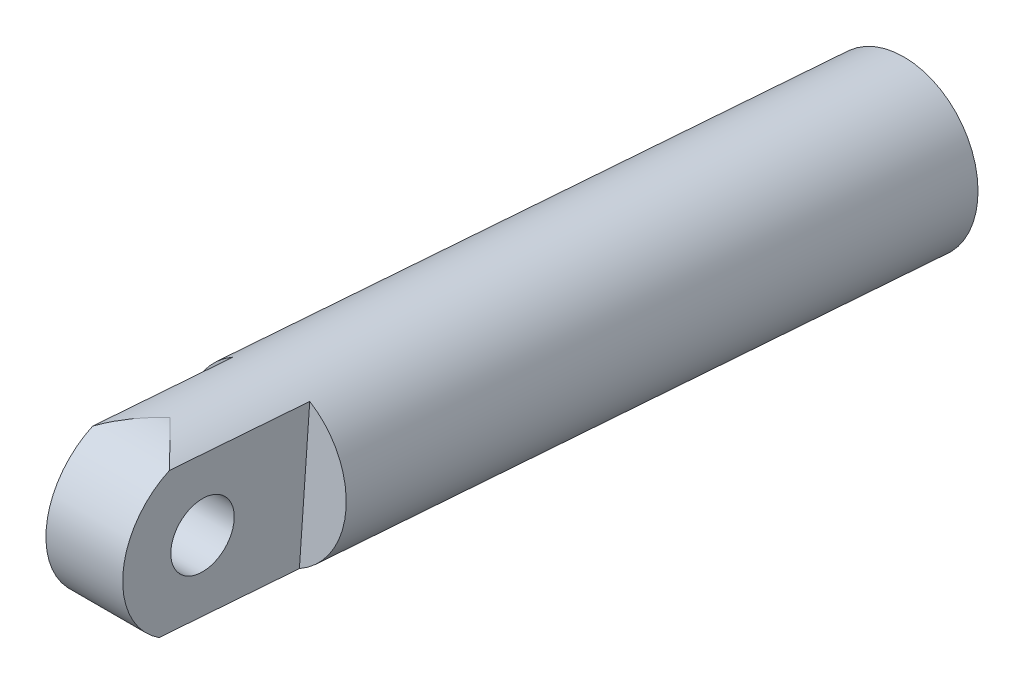
ISO-10303-21;
HEADER;
FILE_DESCRIPTION(('STEP AP214'),'2;1');
FILE_NAME('part.step','',(''),(''),'','','');
FILE_SCHEMA(('AUTOMOTIVE_DESIGN { 1 0 10303 214 1 1 1 1 }'));
ENDSEC;
DATA;
#1=APPLICATION_CONTEXT('core data for automotive mechanical design processes');
#2=APPLICATION_PROTOCOL_DEFINITION('international standard','automotive_design',2000,#1);
#3=PRODUCT_CONTEXT('',#1,'mechanical');
#4=PRODUCT('Part','Part','',(#3));
#5=PRODUCT_RELATED_PRODUCT_CATEGORY('part','',(#4));
#6=PRODUCT_DEFINITION_FORMATION('','',#4);
#7=PRODUCT_DEFINITION_CONTEXT('part definition',#1,'design');
#8=PRODUCT_DEFINITION('design','',#6,#7);
#9=PRODUCT_DEFINITION_SHAPE('','',#8);
#10=(LENGTH_UNIT() NAMED_UNIT(*) SI_UNIT(.MILLI.,.METRE.));
#11=(NAMED_UNIT(*) PLANE_ANGLE_UNIT() SI_UNIT($,.RADIAN.));
#12=(NAMED_UNIT(*) SI_UNIT($,.STERADIAN.) SOLID_ANGLE_UNIT());
#13=UNCERTAINTY_MEASURE_WITH_UNIT(LENGTH_MEASURE(1.E-05),#10,'distance_accuracy_value','');
#14=(GEOMETRIC_REPRESENTATION_CONTEXT(3) GLOBAL_UNCERTAINTY_ASSIGNED_CONTEXT((#13)) GLOBAL_UNIT_ASSIGNED_CONTEXT((#10,
#11,#12)) REPRESENTATION_CONTEXT('',''));
#15=CARTESIAN_POINT('',(0.,0.,0.));
#16=DIRECTION('',(0.,0.,1.));
#17=DIRECTION('',(1.,0.,0.));
#18=AXIS2_PLACEMENT_3D('',#15,#16,#17);
#19=CARTESIAN_POINT('',(0.00139410676342786,24.6152251576294,7.6704800283793));
#20=DIRECTION('',(-1.,0.,0.));
#21=DIRECTION('',(0.,0.,1.));
#22=AXIS2_PLACEMENT_3D('',#19,#20,#21);
#23=CYLINDRICAL_SURFACE('',#22,1.5748);
#24=CARTESIAN_POINT('',(1.90499999999999,24.6152251576294,7.6704800283793));
#25=DIRECTION('',(-1.,0.,0.));
#26=DIRECTION('',(0.,0.,1.));
#27=AXIS2_PLACEMENT_3D('',#24,#25,#26);
#28=CIRCLE('',#27,1.5748);
#29=CARTESIAN_POINT('',(1.90499999999999,24.6152251576294,9.2452800283793));
#30=VERTEX_POINT('',#29);
#31=EDGE_CURVE('E20',#30,#30,#28,.F.);
#32=ORIENTED_EDGE('',*,*,#31,.T.);
#33=EDGE_LOOP('',(#32));
#34=FACE_BOUND('',#33,.T.);
#35=CARTESIAN_POINT('',(-1.90500000000001,24.6152251576294,7.6704800283793));
#36=DIRECTION('',(-1.,0.,0.));
#37=DIRECTION('',(0.,0.,1.));
#38=AXIS2_PLACEMENT_3D('',#35,#36,#37);
#39=CIRCLE('',#38,1.5748);
#40=CARTESIAN_POINT('',(-1.90500000000001,24.6152251576294,9.2452800283793));
#41=VERTEX_POINT('',#40);
#42=EDGE_CURVE('E101',#41,#41,#39,.T.);
#43=ORIENTED_EDGE('',*,*,#42,.T.);
#44=EDGE_LOOP('',(#43));
#45=FACE_BOUND('',#44,.T.);
#46=ADVANCED_FACE('F17',(#34,#45),#23,.F.);
#47=CARTESIAN_POINT('',(5.07999999999998,24.2396114850897,2.6043854409282));
#48=DIRECTION('',(0.,0.0739396993188502,0.997262714065175));
#49=DIRECTION('',(0.,-0.997262714065175,0.0739396993188502));
#50=AXIS2_PLACEMENT_3D('',#47,#48,#49);
#51=PLANE('',#50);
#52=CARTESIAN_POINT('',(0.,24.2396114850897,2.6043854409282));
#53=DIRECTION('',(0.,-0.07393969931885,-0.997262714065175));
#54=DIRECTION('',(0.,0.997262714065175,-0.07393969931885));
#55=AXIS2_PLACEMENT_3D('',#52,#53,#54);
#56=CIRCLE('',#55,3.96239999999999);
#57=CARTESIAN_POINT('',(1.90499999999999,27.7045202037949,2.34748793015695));
#58=VERTEX_POINT('',#57);
#59=CARTESIAN_POINT('',(1.90500000000001,20.7747027663845,2.86128295169945));
#60=VERTEX_POINT('',#59);
#61=EDGE_CURVE('E90',#58,#60,#56,.T.);
#62=ORIENTED_EDGE('',*,*,#61,.F.);
#63=DIRECTION('',(0.,-0.997262714065175,0.0739396993188495));
#64=VECTOR('',#63,1.);
#65=CARTESIAN_POINT('',(1.90499999999998,27.7045202037949,2.34748793015694));
#66=LINE('',#65,#64);
#67=EDGE_CURVE('E95',#58,#60,#66,.T.);
#68=ORIENTED_EDGE('',*,*,#67,.T.);
#69=EDGE_LOOP('',(#62,#68));
#70=FACE_BOUND('',#69,.T.);
#71=ADVANCED_FACE('F114',(#70),#51,.T.);
#72=CARTESIAN_POINT('',(1.905,24.7091285757644,8.93700367524205));
#73=DIRECTION('',(-1.,0.,0.));
#74=DIRECTION('',(0.,-1.,0.));
#75=AXIS2_PLACEMENT_3D('',#72,#73,#74);
#76=PLANE('',#75);
#77=ORIENTED_EDGE('',*,*,#31,.F.);
#78=EDGE_LOOP('',(#77));
#79=FACE_BOUND('',#78,.T.);
#80=DIRECTION('',(0.,-0.07393969931885,-0.997262714065175));
#81=VECTOR('',#80,1.);
#82=CARTESIAN_POINT('',(1.90500000000001,20.3277224960621,-3.16736960736735));
#83=LINE('',#82,#81);
#84=CARTESIAN_POINT('',(1.90500000000001,21.2911715661266,9.82716300944475));
#85=VERTEX_POINT('',#84);
#86=EDGE_CURVE('E87',#60,#85,#83,.F.);
#87=ORIENTED_EDGE('',*,*,#86,.F.);
#88=ORIENTED_EDGE('',*,*,#67,.F.);
#89=DIRECTION('',(0.,-0.07393969931885,-0.997262714065175));
#90=VECTOR('',#89,1.);
#91=CARTESIAN_POINT('',(1.90500000000001,27.2575399334726,-3.68116462890985));
#92=LINE('',#91,#90);
#93=CARTESIAN_POINT('',(1.905,28.220989003537,9.31336798790222));
#94=VERTEX_POINT('',#93);
#95=EDGE_CURVE('E91',#94,#58,#92,.T.);
#96=ORIENTED_EDGE('',*,*,#95,.F.);
#97=CARTESIAN_POINT('',(1.905,24.6152251576294,7.6704800283793));
#98=DIRECTION('',(1.,0.,0.));
#99=DIRECTION('',(0.,1.,0.));
#100=AXIS2_PLACEMENT_3D('',#97,#98,#99);
#101=CIRCLE('',#100,3.96239999999998);
#102=EDGE_CURVE('E73',#85,#94,#101,.F.);
#103=ORIENTED_EDGE('',*,*,#102,.F.);
#104=EDGE_LOOP('',(#87,#88,#96,#103));
#105=FACE_BOUND('',#104,.T.);
#106=ADVANCED_FACE('F110',(#79,#105),#76,.F.);
#107=CARTESIAN_POINT('',(0.00139410676342857,24.6152251576294,7.6704800283793));
#108=DIRECTION('',(1.,0.,0.));
#109=DIRECTION('',(0.,1.,0.));
#110=AXIS2_PLACEMENT_3D('',#107,#108,#109);
#111=CYLINDRICAL_SURFACE('',#110,3.96239999999998);
#112=CARTESIAN_POINT('',(0.,24.6152251576294,7.6704800283793));
#113=DIRECTION('',(0.707106781186548,-0.0522832627872527,-0.705171227739986));
#114=DIRECTION('',(-0.707106781186547,-0.0522832627872537,-0.705171227739986));
#115=AXIS2_PLACEMENT_3D('',#112,#113,#114);
#116=ELLIPSE('',#115,5.60367981954713,3.96239999999999);
#117=CARTESIAN_POINT('',(0.,20.6636713794176,7.96345869296032));
#118=VERTEX_POINT('',#117);
#119=EDGE_CURVE('E83',#85,#118,#116,.T.);
#120=ORIENTED_EDGE('',*,*,#119,.F.);
#121=ORIENTED_EDGE('',*,*,#102,.T.);
#122=CARTESIAN_POINT('',(0.,24.6152251576294,7.6704800283793));
#123=DIRECTION('',(0.707106781186548,-0.0522832627872527,-0.705171227739986));
#124=DIRECTION('',(-0.707106781186547,-0.0522832627872537,-0.705171227739986));
#125=AXIS2_PLACEMENT_3D('',#122,#123,#124);
#126=ELLIPSE('',#125,5.60367981954713,3.96239999999999);
#127=CARTESIAN_POINT('',(0.,28.5667789358413,7.37750136379829));
#128=VERTEX_POINT('',#127);
#129=EDGE_CURVE('E93',#128,#94,#126,.T.);
#130=ORIENTED_EDGE('',*,*,#129,.F.);
#131=CARTESIAN_POINT('',(0.,24.6152251576294,7.6704800283793));
#132=DIRECTION('',(0.707106781186547,0.0522832627872537,0.705171227739986));
#133=DIRECTION('',(0.707106781186548,-0.0522832627872527,-0.705171227739986));
#134=AXIS2_PLACEMENT_3D('',#131,#132,#133);
#135=ELLIPSE('',#134,5.60367981954713,3.96239999999999);
#136=CARTESIAN_POINT('',(-1.90500000000002,28.220989003537,9.31336798790218));
#137=VERTEX_POINT('',#136);
#138=EDGE_CURVE('E33',#128,#137,#135,.T.);
#139=ORIENTED_EDGE('',*,*,#138,.T.);
#140=CARTESIAN_POINT('',(-1.90500000000002,24.6152251576294,7.6704800283793));
#141=DIRECTION('',(1.,0.,0.));
#142=DIRECTION('',(0.,1.,0.));
#143=AXIS2_PLACEMENT_3D('',#140,#141,#142);
#144=CIRCLE('',#143,3.96239999999998);
#145=CARTESIAN_POINT('',(-1.90500000000001,21.2911715661266,9.8271630094447));
#146=VERTEX_POINT('',#145);
#147=EDGE_CURVE('E72',#137,#146,#144,.T.);
#148=ORIENTED_EDGE('',*,*,#147,.T.);
#149=CARTESIAN_POINT('',(0.,24.6152251576294,7.6704800283793));
#150=DIRECTION('',(-0.707106781186547,-0.0522832627872537,-0.705171227739986));
#151=DIRECTION('',(0.707106781186548,-0.0522832627872527,-0.705171227739986));
#152=AXIS2_PLACEMENT_3D('',#149,#150,#151);
#153=ELLIPSE('',#152,5.60367981954713,3.96239999999999);
#154=EDGE_CURVE('E81',#118,#146,#153,.T.);
#155=ORIENTED_EDGE('',*,*,#154,.F.);
#156=EDGE_LOOP('',(#120,#121,#130,#139,#148,#155));
#157=FACE_BOUND('',#156,.T.);
#158=ADVANCED_FACE('F113',(#157),#111,.T.);
#159=CARTESIAN_POINT('',(-5.08000000000003,24.2396114850897,2.6043854409282));
#160=DIRECTION('',(0.,0.0739396993188502,0.997262714065175));
#161=DIRECTION('',(0.,-0.997262714065175,0.0739396993188502));
#162=AXIS2_PLACEMENT_3D('',#159,#160,#161);
#163=PLANE('',#162);
#164=CARTESIAN_POINT('',(0.,24.2396114850897,2.60438544092821));
#165=DIRECTION('',(0.,-0.07393969931885,-0.997262714065175));
#166=DIRECTION('',(0.,0.997262714065175,-0.07393969931885));
#167=AXIS2_PLACEMENT_3D('',#164,#165,#166);
#168=CIRCLE('',#167,3.96239999999999);
#169=CARTESIAN_POINT('',(-1.90500000000001,20.7747027663844,2.86128295169946));
#170=VERTEX_POINT('',#169);
#171=CARTESIAN_POINT('',(-1.90500000000001,27.7045202037949,2.34748793015695));
#172=VERTEX_POINT('',#171);
#173=EDGE_CURVE('E75',#170,#172,#168,.T.);
#174=ORIENTED_EDGE('',*,*,#173,.F.);
#175=DIRECTION('',(0.,0.997262714065175,-0.0739396993188503));
#176=VECTOR('',#175,1.);
#177=CARTESIAN_POINT('',(-1.90500000000001,20.7747027663844,2.86128295169946));
#178=LINE('',#177,#176);
#179=EDGE_CURVE('E64',#170,#172,#178,.T.);
#180=ORIENTED_EDGE('',*,*,#179,.T.);
#181=EDGE_LOOP('',(#174,#180));
#182=FACE_BOUND('',#181,.T.);
#183=ADVANCED_FACE('F76',(#182),#163,.T.);
#184=CARTESIAN_POINT('',(-1.90500000000001,24.7091285757644,8.93700367524205));
#185=DIRECTION('',(1.,0.,0.));
#186=DIRECTION('',(0.,0.,-1.));
#187=AXIS2_PLACEMENT_3D('',#184,#185,#186);
#188=PLANE('',#187);
#189=ORIENTED_EDGE('',*,*,#42,.F.);
#190=EDGE_LOOP('',(#189));
#191=FACE_BOUND('',#190,.T.);
#192=DIRECTION('',(0.,-0.07393969931885,-0.997262714065175));
#193=VECTOR('',#192,1.);
#194=CARTESIAN_POINT('',(-1.90500000000002,27.2575399334726,-3.68116462890985));
#195=LINE('',#194,#193);
#196=EDGE_CURVE('E25',#172,#137,#195,.F.);
#197=ORIENTED_EDGE('',*,*,#196,.F.);
#198=ORIENTED_EDGE('',*,*,#179,.F.);
#199=DIRECTION('',(0.,-0.07393969931885,-0.997262714065175));
#200=VECTOR('',#199,1.);
#201=CARTESIAN_POINT('',(-1.90500000000001,20.3277224960621,-3.16736960736735));
#202=LINE('',#201,#200);
#203=EDGE_CURVE('E68',#146,#170,#202,.T.);
#204=ORIENTED_EDGE('',*,*,#203,.F.);
#205=ORIENTED_EDGE('',*,*,#147,.F.);
#206=EDGE_LOOP('',(#197,#198,#204,#205));
#207=FACE_BOUND('',#206,.T.);
#208=ADVANCED_FACE('F66',(#191,#207),#188,.F.);
#209=CARTESIAN_POINT('',(0.,21.9145628520685,-28.754740055394));
#210=DIRECTION('',(0.,-0.0739396993188503,-0.997262714065175));
#211=DIRECTION('',(0.,0.997262714065175,-0.0739396993188503));
#212=AXIS2_PLACEMENT_3D('',#209,#210,#211);
#213=PLANE('',#212);
#214=CARTESIAN_POINT('',(0.,21.9145628520686,-28.7547400553941));
#215=DIRECTION('',(0.,-0.07393969931885,-0.997262714065175));
#216=DIRECTION('',(0.,0.997262714065175,-0.07393969931885));
#217=AXIS2_PLACEMENT_3D('',#214,#215,#216);
#218=CIRCLE('',#217,3.96239999999999);
#219=CARTESIAN_POINT('',(0.,25.8661166302804,-29.0477187199751));
#220=VERTEX_POINT('',#219);
#221=EDGE_CURVE('E11',#220,#220,#218,.F.);
#222=ORIENTED_EDGE('',*,*,#221,.F.);
#223=EDGE_LOOP('',(#222));
#224=FACE_BOUND('',#223,.T.);
#225=ADVANCED_FACE('F126',(#224),#213,.T.);
#226=CARTESIAN_POINT('',(0.,23.7926312147673,-3.4242671181386));
#227=DIRECTION('',(0.,-0.07393969931885,-0.997262714065175));
#228=DIRECTION('',(0.,0.997262714065175,-0.07393969931885));
#229=AXIS2_PLACEMENT_3D('',#226,#227,#228);
#230=CYLINDRICAL_SURFACE('',#229,3.96239999999999);
#231=ORIENTED_EDGE('',*,*,#119,.T.);
#232=ORIENTED_EDGE('',*,*,#154,.T.);
#233=ORIENTED_EDGE('',*,*,#203,.T.);
#234=ORIENTED_EDGE('',*,*,#173,.T.);
#235=ORIENTED_EDGE('',*,*,#196,.T.);
#236=ORIENTED_EDGE('',*,*,#138,.F.);
#237=ORIENTED_EDGE('',*,*,#129,.T.);
#238=ORIENTED_EDGE('',*,*,#95,.T.);
#239=ORIENTED_EDGE('',*,*,#61,.T.);
#240=ORIENTED_EDGE('',*,*,#86,.T.);
#241=EDGE_LOOP('',(#231,#232,#233,#234,#235,#236,#237,#238,#239,#240));
#242=FACE_BOUND('',#241,.T.);
#243=ORIENTED_EDGE('',*,*,#221,.T.);
#244=EDGE_LOOP('',(#243));
#245=FACE_BOUND('',#244,.T.);
#246=ADVANCED_FACE('F78',(#242,#245),#230,.T.);
#247=CLOSED_SHELL('',(#46,#71,#106,#158,#183,#208,#225,#246));
#248=MANIFOLD_SOLID_BREP('B1',#247);
#249=ADVANCED_BREP_SHAPE_REPRESENTATION('',(#18,#248),#14);
#250=SHAPE_DEFINITION_REPRESENTATION(#9,#249);
ENDSEC;
END-ISO-10303-21;
